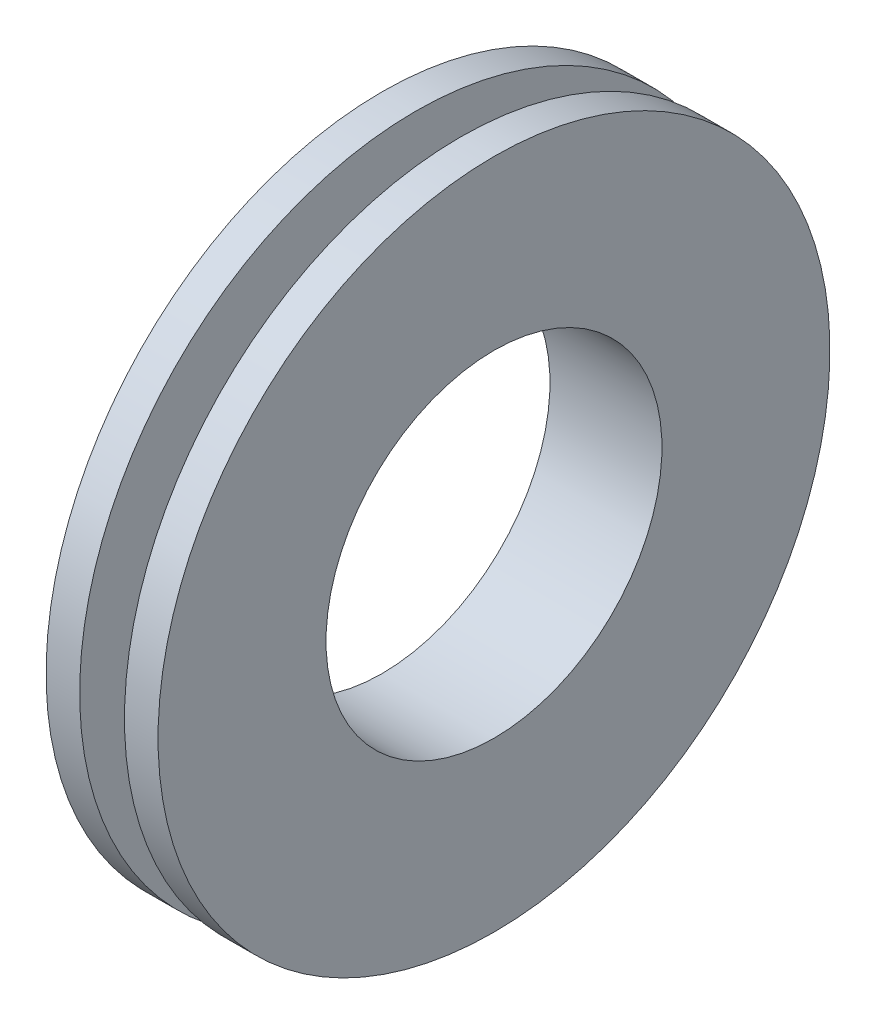
ISO-10303-21;
HEADER;
FILE_DESCRIPTION(('STEP AP214'),'2;1');
FILE_NAME('part.step','',(''),(''),'','','');
FILE_SCHEMA(('AUTOMOTIVE_DESIGN { 1 0 10303 214 1 1 1 1 }'));
ENDSEC;
DATA;
#1=APPLICATION_CONTEXT('core data for automotive mechanical design processes');
#2=APPLICATION_PROTOCOL_DEFINITION('international standard','automotive_design',2000,#1);
#3=PRODUCT_CONTEXT('',#1,'mechanical');
#4=PRODUCT('Part','Part','',(#3));
#5=PRODUCT_RELATED_PRODUCT_CATEGORY('part','',(#4));
#6=PRODUCT_DEFINITION_FORMATION('','',#4);
#7=PRODUCT_DEFINITION_CONTEXT('part definition',#1,'design');
#8=PRODUCT_DEFINITION('design','',#6,#7);
#9=PRODUCT_DEFINITION_SHAPE('','',#8);
#10=(LENGTH_UNIT() NAMED_UNIT(*) SI_UNIT(.MILLI.,.METRE.));
#11=(NAMED_UNIT(*) PLANE_ANGLE_UNIT() SI_UNIT($,.RADIAN.));
#12=(NAMED_UNIT(*) SI_UNIT($,.STERADIAN.) SOLID_ANGLE_UNIT());
#13=UNCERTAINTY_MEASURE_WITH_UNIT(LENGTH_MEASURE(1.E-05),#10,'distance_accuracy_value','');
#14=(GEOMETRIC_REPRESENTATION_CONTEXT(3) GLOBAL_UNCERTAINTY_ASSIGNED_CONTEXT((#13)) GLOBAL_UNIT_ASSIGNED_CONTEXT((#10,
#11,#12)) REPRESENTATION_CONTEXT('',''));
#15=CARTESIAN_POINT('',(0.,0.,0.));
#16=DIRECTION('',(0.,0.,1.));
#17=DIRECTION('',(1.,0.,0.));
#18=AXIS2_PLACEMENT_3D('',#15,#16,#17);
#19=CARTESIAN_POINT('',(0.,30.,0.));
#20=DIRECTION('',(1.,0.,0.));
#21=DIRECTION('',(0.,1.,0.));
#22=AXIS2_PLACEMENT_3D('',#19,#20,#21);
#23=PLANE('',#22);
#24=CARTESIAN_POINT('',(2.07636252560705E-13,0.,0.));
#25=DIRECTION('',(1.,0.,0.));
#26=DIRECTION('',(0.,1.,0.));
#27=AXIS2_PLACEMENT_3D('',#24,#25,#26);
#28=CIRCLE('',#27,30.);
#29=CARTESIAN_POINT('',(0.,30.,0.));
#30=VERTEX_POINT('',#29);
#31=EDGE_CURVE('E62',#30,#30,#28,.T.);
#32=ORIENTED_EDGE('',*,*,#31,.T.);
#33=EDGE_LOOP('',(#32));
#34=FACE_BOUND('',#33,.T.);
#35=CARTESIAN_POINT('',(1.04736611379713E-13,0.,0.));
#36=DIRECTION('',(1.,0.,0.));
#37=DIRECTION('',(0.,1.,0.));
#38=AXIS2_PLACEMENT_3D('',#35,#36,#37);
#39=CIRCLE('',#38,15.);
#40=CARTESIAN_POINT('',(0.,15.,0.));
#41=VERTEX_POINT('',#40);
#42=EDGE_CURVE('E10',#41,#41,#39,.T.);
#43=ORIENTED_EDGE('',*,*,#42,.F.);
#44=EDGE_LOOP('',(#43));
#45=FACE_BOUND('',#44,.T.);
#46=ADVANCED_FACE('F34',(#34,#45),#23,.T.);
#47=CARTESIAN_POINT('',(0.,0.,0.));
#48=DIRECTION('',(1.,0.,0.));
#49=DIRECTION('',(0.,1.,0.));
#50=AXIS2_PLACEMENT_3D('',#47,#48,#49);
#51=CYLINDRICAL_SURFACE('',#50,15.);
#52=ORIENTED_EDGE('',*,*,#42,.T.);
#53=EDGE_LOOP('',(#52));
#54=FACE_BOUND('',#53,.T.);
#55=CARTESIAN_POINT('',(-9.9999999999999,0.,0.));
#56=DIRECTION('',(1.,0.,0.));
#57=DIRECTION('',(0.,1.,0.));
#58=AXIS2_PLACEMENT_3D('',#55,#56,#57);
#59=CIRCLE('',#58,15.0000000000001);
#60=CARTESIAN_POINT('',(-10.,15.,0.));
#61=VERTEX_POINT('',#60);
#62=EDGE_CURVE('E40',#61,#61,#59,.T.);
#63=ORIENTED_EDGE('',*,*,#62,.F.);
#64=EDGE_LOOP('',(#63));
#65=FACE_BOUND('',#64,.T.);
#66=ADVANCED_FACE('F80',(#54,#65),#51,.F.);
#67=CARTESIAN_POINT('',(-9.99999999999995,15.,0.));
#68=DIRECTION('',(-1.,0.,0.));
#69=DIRECTION('',(0.,-1.,0.));
#70=AXIS2_PLACEMENT_3D('',#67,#68,#69);
#71=PLANE('',#70);
#72=ORIENTED_EDGE('',*,*,#62,.T.);
#73=EDGE_LOOP('',(#72));
#74=FACE_BOUND('',#73,.T.);
#75=CARTESIAN_POINT('',(-9.99999999999979,0.,0.));
#76=DIRECTION('',(1.,0.,0.));
#77=DIRECTION('',(0.,1.,0.));
#78=AXIS2_PLACEMENT_3D('',#75,#76,#77);
#79=CIRCLE('',#78,30.0000000000001);
#80=CARTESIAN_POINT('',(-10.,30.,0.));
#81=VERTEX_POINT('',#80);
#82=EDGE_CURVE('E44',#81,#81,#79,.T.);
#83=ORIENTED_EDGE('',*,*,#82,.F.);
#84=EDGE_LOOP('',(#83));
#85=FACE_BOUND('',#84,.T.);
#86=ADVANCED_FACE('F84',(#74,#85),#71,.T.);
#87=CARTESIAN_POINT('',(0.,0.,0.));
#88=DIRECTION('',(1.,0.,0.));
#89=DIRECTION('',(0.,1.,0.));
#90=AXIS2_PLACEMENT_3D('',#87,#88,#89);
#91=CYLINDRICAL_SURFACE('',#90,30.0000000000001);
#92=ORIENTED_EDGE('',*,*,#82,.T.);
#93=EDGE_LOOP('',(#92));
#94=FACE_BOUND('',#93,.T.);
#95=CARTESIAN_POINT('',(-6.99999999999979,0.,0.));
#96=DIRECTION('',(1.,0.,0.));
#97=DIRECTION('',(0.,1.,0.));
#98=AXIS2_PLACEMENT_3D('',#95,#96,#97);
#99=CIRCLE('',#98,30.);
#100=CARTESIAN_POINT('',(-7.,30.,0.));
#101=VERTEX_POINT('',#100);
#102=EDGE_CURVE('E48',#101,#101,#99,.T.);
#103=ORIENTED_EDGE('',*,*,#102,.F.);
#104=EDGE_LOOP('',(#103));
#105=FACE_BOUND('',#104,.T.);
#106=ADVANCED_FACE('F88',(#94,#105),#91,.T.);
#107=CARTESIAN_POINT('',(-7.00000000000003,30.,0.));
#108=DIRECTION('',(1.,0.,0.));
#109=DIRECTION('',(0.,1.,0.));
#110=AXIS2_PLACEMENT_3D('',#107,#108,#109);
#111=PLANE('',#110);
#112=ORIENTED_EDGE('',*,*,#102,.T.);
#113=EDGE_LOOP('',(#112));
#114=FACE_BOUND('',#113,.T.);
#115=CARTESIAN_POINT('',(-6.99999999999985,0.,0.));
#116=DIRECTION('',(1.,0.,0.));
#117=DIRECTION('',(0.,1.,0.));
#118=AXIS2_PLACEMENT_3D('',#115,#116,#117);
#119=CIRCLE('',#118,22.);
#120=CARTESIAN_POINT('',(-7.,22.,0.));
#121=VERTEX_POINT('',#120);
#122=EDGE_CURVE('E53',#121,#121,#119,.T.);
#123=ORIENTED_EDGE('',*,*,#122,.F.);
#124=EDGE_LOOP('',(#123));
#125=FACE_BOUND('',#124,.T.);
#126=ADVANCED_FACE('F94',(#114,#125),#111,.T.);
#127=CARTESIAN_POINT('',(0.,0.,0.));
#128=DIRECTION('',(1.,0.,0.));
#129=DIRECTION('',(0.,1.,0.));
#130=AXIS2_PLACEMENT_3D('',#127,#128,#129);
#131=CYLINDRICAL_SURFACE('',#130,22.);
#132=ORIENTED_EDGE('',*,*,#122,.T.);
#133=EDGE_LOOP('',(#132));
#134=FACE_BOUND('',#133,.T.);
#135=CARTESIAN_POINT('',(-2.99999999999985,0.,0.));
#136=DIRECTION('',(1.,0.,0.));
#137=DIRECTION('',(0.,1.,0.));
#138=AXIS2_PLACEMENT_3D('',#135,#136,#137);
#139=CIRCLE('',#138,22.);
#140=CARTESIAN_POINT('',(-3.,22.,0.));
#141=VERTEX_POINT('',#140);
#142=EDGE_CURVE('E56',#141,#141,#139,.T.);
#143=ORIENTED_EDGE('',*,*,#142,.F.);
#144=EDGE_LOOP('',(#143));
#145=FACE_BOUND('',#144,.T.);
#146=ADVANCED_FACE('F76',(#134,#145),#131,.T.);
#147=CARTESIAN_POINT('',(-2.99999999999997,22.,0.));
#148=DIRECTION('',(-1.,0.,0.));
#149=DIRECTION('',(0.,-1.,0.));
#150=AXIS2_PLACEMENT_3D('',#147,#148,#149);
#151=PLANE('',#150);
#152=ORIENTED_EDGE('',*,*,#142,.T.);
#153=EDGE_LOOP('',(#152));
#154=FACE_BOUND('',#153,.T.);
#155=CARTESIAN_POINT('',(-2.99999999999979,0.,0.));
#156=DIRECTION('',(1.,0.,0.));
#157=DIRECTION('',(0.,1.,0.));
#158=AXIS2_PLACEMENT_3D('',#155,#156,#157);
#159=CIRCLE('',#158,30.);
#160=CARTESIAN_POINT('',(-3.,30.,0.));
#161=VERTEX_POINT('',#160);
#162=EDGE_CURVE('E59',#161,#161,#159,.T.);
#163=ORIENTED_EDGE('',*,*,#162,.F.);
#164=EDGE_LOOP('',(#163));
#165=FACE_BOUND('',#164,.T.);
#166=ADVANCED_FACE('F70',(#154,#165),#151,.T.);
#167=CARTESIAN_POINT('',(0.,0.,0.));
#168=DIRECTION('',(1.,0.,0.));
#169=DIRECTION('',(0.,1.,0.));
#170=AXIS2_PLACEMENT_3D('',#167,#168,#169);
#171=CYLINDRICAL_SURFACE('',#170,30.);
#172=ORIENTED_EDGE('',*,*,#162,.T.);
#173=EDGE_LOOP('',(#172));
#174=FACE_BOUND('',#173,.T.);
#175=ORIENTED_EDGE('',*,*,#31,.F.);
#176=EDGE_LOOP('',(#175));
#177=FACE_BOUND('',#176,.T.);
#178=ADVANCED_FACE('F68',(#174,#177),#171,.T.);
#179=CLOSED_SHELL('',(#46,#66,#86,#106,#126,#146,#166,#178));
#180=MANIFOLD_SOLID_BREP('B2',#179);
#181=ADVANCED_BREP_SHAPE_REPRESENTATION('',(#18,#180),#14);
#182=SHAPE_DEFINITION_REPRESENTATION(#9,#181);
ENDSEC;
END-ISO-10303-21;
